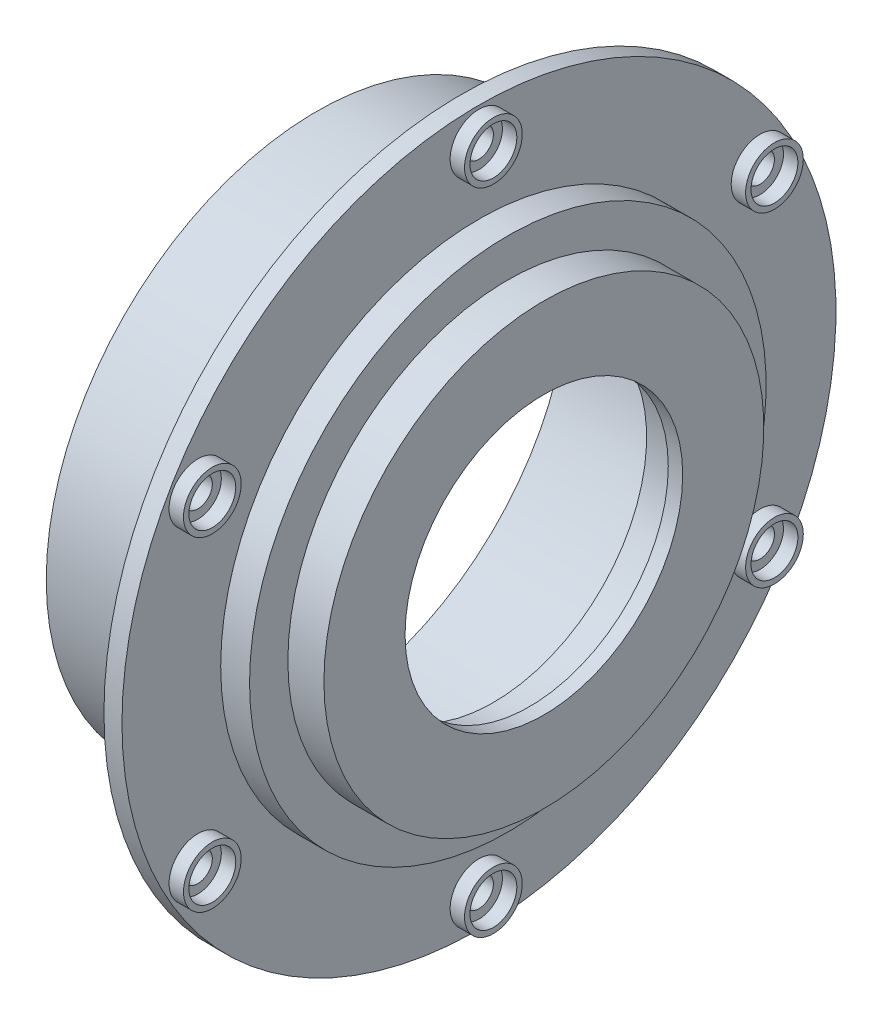
ISO-10303-21;
HEADER;
FILE_DESCRIPTION(('STEP AP214'),'2;1');
FILE_NAME('part.step','',(''),(''),'','','');
FILE_SCHEMA(('AUTOMOTIVE_DESIGN { 1 0 10303 214 1 1 1 1 }'));
ENDSEC;
DATA;
#1=APPLICATION_CONTEXT('core data for automotive mechanical design processes');
#2=APPLICATION_PROTOCOL_DEFINITION('international standard','automotive_design',2000,#1);
#3=PRODUCT_CONTEXT('',#1,'mechanical');
#4=PRODUCT('Part','Part','',(#3));
#5=PRODUCT_RELATED_PRODUCT_CATEGORY('part','',(#4));
#6=PRODUCT_DEFINITION_FORMATION('','',#4);
#7=PRODUCT_DEFINITION_CONTEXT('part definition',#1,'design');
#8=PRODUCT_DEFINITION('design','',#6,#7);
#9=PRODUCT_DEFINITION_SHAPE('','',#8);
#10=(LENGTH_UNIT() NAMED_UNIT(*) SI_UNIT(.MILLI.,.METRE.));
#11=(NAMED_UNIT(*) PLANE_ANGLE_UNIT() SI_UNIT($,.RADIAN.));
#12=(NAMED_UNIT(*) SI_UNIT($,.STERADIAN.) SOLID_ANGLE_UNIT());
#13=UNCERTAINTY_MEASURE_WITH_UNIT(LENGTH_MEASURE(1.E-05),#10,'distance_accuracy_value','');
#14=(GEOMETRIC_REPRESENTATION_CONTEXT(3) GLOBAL_UNCERTAINTY_ASSIGNED_CONTEXT((#13)) GLOBAL_UNIT_ASSIGNED_CONTEXT((#10,
#11,#12)) REPRESENTATION_CONTEXT('',''));
#15=CARTESIAN_POINT('',(0.,0.,0.));
#16=DIRECTION('',(0.,0.,1.));
#17=DIRECTION('',(1.,0.,0.));
#18=AXIS2_PLACEMENT_3D('',#15,#16,#17);
#19=CARTESIAN_POINT('',(45.,29.,0.));
#20=DIRECTION('',(-1.,0.,0.));
#21=DIRECTION('',(0.,0.,1.));
#22=AXIS2_PLACEMENT_3D('',#19,#20,#21);
#23=PLANE('',#22);
#24=CARTESIAN_POINT('',(45.,20.,0.));
#25=DIRECTION('',(1.,0.,0.));
#26=DIRECTION('',(0.,0.,-1.));
#27=AXIS2_PLACEMENT_3D('',#24,#25,#26);
#28=CIRCLE('',#27,4.);
#29=CARTESIAN_POINT('',(45.,20.,-4.));
#30=VERTEX_POINT('',#29);
#31=EDGE_CURVE('E165',#30,#30,#28,.T.);
#32=ORIENTED_EDGE('',*,*,#31,.F.);
#33=EDGE_LOOP('',(#32));
#34=FACE_BOUND('',#33,.T.);
#35=CARTESIAN_POINT('',(45.,20.,0.));
#36=DIRECTION('',(1.,0.,0.));
#37=DIRECTION('',(0.,0.,-1.));
#38=AXIS2_PLACEMENT_3D('',#35,#36,#37);
#39=CIRCLE('',#38,6.5);
#40=CARTESIAN_POINT('',(45.,20.,-6.5));
#41=VERTEX_POINT('',#40);
#42=EDGE_CURVE('E236',#41,#41,#39,.T.);
#43=ORIENTED_EDGE('',*,*,#42,.T.);
#44=EDGE_LOOP('',(#43));
#45=FACE_BOUND('',#44,.T.);
#46=ADVANCED_FACE('F45',(#34,#45),#23,.F.);
#47=CARTESIAN_POINT('',(45.,-25.000000000001,77.9422863405978));
#48=DIRECTION('',(1.,0.,0.));
#49=DIRECTION('',(0.,0.,-1.));
#50=AXIS2_PLACEMENT_3D('',#47,#48,#49);
#51=CIRCLE('',#50,4.00000000000001);
#52=CARTESIAN_POINT('',(45.,-25.000000000001,73.9422863405978));
#53=VERTEX_POINT('',#52);
#54=EDGE_CURVE('E171',#53,#53,#51,.T.);
#55=ORIENTED_EDGE('',*,*,#54,.F.);
#56=EDGE_LOOP('',(#55));
#57=FACE_BOUND('',#56,.T.);
#58=CARTESIAN_POINT('',(45.,-25.0000000000046,77.9422863405958));
#59=DIRECTION('',(1.,0.,0.));
#60=DIRECTION('',(0.,0.,-1.));
#61=AXIS2_PLACEMENT_3D('',#58,#59,#60);
#62=CIRCLE('',#61,6.5);
#63=CARTESIAN_POINT('',(45.,-25.0000000000046,71.4422863405958));
#64=VERTEX_POINT('',#63);
#65=EDGE_CURVE('E203',#64,#64,#62,.T.);
#66=ORIENTED_EDGE('',*,*,#65,.T.);
#67=EDGE_LOOP('',(#66));
#68=FACE_BOUND('',#67,.T.);
#69=ADVANCED_FACE('F282',(#57,#68),#23,.F.);
#70=CARTESIAN_POINT('',(45.,-115.000000000001,77.9422863405965));
#71=DIRECTION('',(1.,0.,0.));
#72=DIRECTION('',(0.,0.,-1.));
#73=AXIS2_PLACEMENT_3D('',#70,#71,#72);
#74=CIRCLE('',#73,4.00000000000001);
#75=CARTESIAN_POINT('',(45.,-115.000000000001,73.9422863405965));
#76=VERTEX_POINT('',#75);
#77=EDGE_CURVE('E166',#76,#76,#74,.T.);
#78=ORIENTED_EDGE('',*,*,#77,.F.);
#79=EDGE_LOOP('',(#78));
#80=FACE_BOUND('',#79,.T.);
#81=CARTESIAN_POINT('',(45.,-115.000000000005,77.9422863405903));
#82=DIRECTION('',(1.,0.,0.));
#83=DIRECTION('',(0.,0.,-1.));
#84=AXIS2_PLACEMENT_3D('',#81,#82,#83);
#85=CIRCLE('',#84,6.5);
#86=CARTESIAN_POINT('',(45.,-115.000000000005,71.4422863405903));
#87=VERTEX_POINT('',#86);
#88=EDGE_CURVE('E194',#87,#87,#85,.T.);
#89=ORIENTED_EDGE('',*,*,#88,.T.);
#90=EDGE_LOOP('',(#89));
#91=FACE_BOUND('',#90,.T.);
#92=ADVANCED_FACE('F290',(#80,#91),#23,.F.);
#93=CARTESIAN_POINT('',(45.,-160.,-3.8049674916468E-12));
#94=DIRECTION('',(1.,0.,0.));
#95=DIRECTION('',(0.,0.,-1.));
#96=AXIS2_PLACEMENT_3D('',#93,#94,#95);
#97=CIRCLE('',#96,4.);
#98=CARTESIAN_POINT('',(45.,-160.,-4.00000000000381));
#99=VERTEX_POINT('',#98);
#100=EDGE_CURVE('E170',#99,#99,#97,.T.);
#101=ORIENTED_EDGE('',*,*,#100,.F.);
#102=EDGE_LOOP('',(#101));
#103=FACE_BOUND('',#102,.T.);
#104=CARTESIAN_POINT('',(45.,-160.,-1.211831750004E-11));
#105=DIRECTION('',(1.,0.,0.));
#106=DIRECTION('',(0.,0.,-1.));
#107=AXIS2_PLACEMENT_3D('',#104,#105,#106);
#108=CIRCLE('',#107,6.5);
#109=CARTESIAN_POINT('',(45.,-160.,-6.50000000001212));
#110=VERTEX_POINT('',#109);
#111=EDGE_CURVE('E208',#110,#110,#108,.T.);
#112=ORIENTED_EDGE('',*,*,#111,.T.);
#113=EDGE_LOOP('',(#112));
#114=FACE_BOUND('',#113,.T.);
#115=ADVANCED_FACE('F320',(#103,#114),#23,.F.);
#116=CARTESIAN_POINT('',(45.,-114.999999999998,-77.9422863406026));
#117=DIRECTION('',(1.,0.,0.));
#118=DIRECTION('',(0.,0.,-1.));
#119=AXIS2_PLACEMENT_3D('',#116,#117,#118);
#120=CIRCLE('',#119,4.00000000000001);
#121=CARTESIAN_POINT('',(45.,-114.999999999998,-81.9422863406026));
#122=VERTEX_POINT('',#121);
#123=EDGE_CURVE('E175',#122,#122,#120,.T.);
#124=ORIENTED_EDGE('',*,*,#123,.F.);
#125=EDGE_LOOP('',(#124));
#126=FACE_BOUND('',#125,.T.);
#127=CARTESIAN_POINT('',(45.,-114.999999999995,-77.9422863406088));
#128=DIRECTION('',(1.,0.,0.));
#129=DIRECTION('',(0.,0.,-1.));
#130=AXIS2_PLACEMENT_3D('',#127,#128,#129);
#131=CIRCLE('',#130,6.5);
#132=CARTESIAN_POINT('',(45.,-114.999999999995,-84.4422863406088));
#133=VERTEX_POINT('',#132);
#134=EDGE_CURVE('E220',#133,#133,#131,.T.);
#135=ORIENTED_EDGE('',*,*,#134,.T.);
#136=EDGE_LOOP('',(#135));
#137=FACE_BOUND('',#136,.T.);
#138=ADVANCED_FACE('F312',(#126,#137),#23,.F.);
#139=CARTESIAN_POINT('',(45.,-24.9999999999982,-77.9422863406007));
#140=DIRECTION('',(1.,0.,0.));
#141=DIRECTION('',(0.,0.,-1.));
#142=AXIS2_PLACEMENT_3D('',#139,#140,#141);
#143=CIRCLE('',#142,4.00000000000001);
#144=CARTESIAN_POINT('',(45.,-24.9999999999982,-81.9422863406007));
#145=VERTEX_POINT('',#144);
#146=EDGE_CURVE('E179',#145,#145,#143,.T.);
#147=ORIENTED_EDGE('',*,*,#146,.F.);
#148=EDGE_LOOP('',(#147));
#149=FACE_BOUND('',#148,.T.);
#150=CARTESIAN_POINT('',(45.,-24.9999999999947,-77.9422863406027));
#151=DIRECTION('',(1.,0.,0.));
#152=DIRECTION('',(0.,0.,-1.));
#153=AXIS2_PLACEMENT_3D('',#150,#151,#152);
#154=CIRCLE('',#153,6.5);
#155=CARTESIAN_POINT('',(45.,-24.9999999999947,-84.4422863406028));
#156=VERTEX_POINT('',#155);
#157=EDGE_CURVE('E232',#156,#156,#154,.T.);
#158=ORIENTED_EDGE('',*,*,#157,.T.);
#159=EDGE_LOOP('',(#158));
#160=FACE_BOUND('',#159,.T.);
#161=ADVANCED_FACE('F300',(#149,#160),#23,.F.);
#162=CARTESIAN_POINT('',(0.,0.,0.));
#163=DIRECTION('',(1.,0.,0.));
#164=DIRECTION('',(0.,0.,-1.));
#165=AXIS2_PLACEMENT_3D('',#162,#163,#164);
#166=PLANE('',#165);
#167=CARTESIAN_POINT('',(0.,-70.,0.));
#168=DIRECTION('',(-1.,0.,0.));
#169=DIRECTION('',(0.,0.,1.));
#170=AXIS2_PLACEMENT_3D('',#167,#168,#169);
#171=CIRCLE('',#170,70.);
#172=CARTESIAN_POINT('',(0.,-70.,70.));
#173=VERTEX_POINT('',#172);
#174=EDGE_CURVE('E137',#173,#173,#171,.T.);
#175=ORIENTED_EDGE('',*,*,#174,.F.);
#176=EDGE_LOOP('',(#175));
#177=FACE_BOUND('',#176,.T.);
#178=CARTESIAN_POINT('',(0.,-70.,0.));
#179=DIRECTION('',(-1.,0.,0.));
#180=DIRECTION('',(0.,0.,1.));
#181=AXIS2_PLACEMENT_3D('',#178,#179,#180);
#182=CIRCLE('',#181,75.);
#183=CARTESIAN_POINT('',(0.,-70.,75.));
#184=VERTEX_POINT('',#183);
#185=EDGE_CURVE('E77',#184,#184,#182,.T.);
#186=ORIENTED_EDGE('',*,*,#185,.T.);
#187=EDGE_LOOP('',(#186));
#188=FACE_BOUND('',#187,.T.);
#189=ADVANCED_FACE('F47',(#177,#188),#166,.F.);
#190=CARTESIAN_POINT('',(0.,-70.,0.));
#191=DIRECTION('',(-1.,0.,0.));
#192=DIRECTION('',(0.,0.,1.));
#193=AXIS2_PLACEMENT_3D('',#190,#191,#192);
#194=CYLINDRICAL_SURFACE('',#193,75.);
#195=ORIENTED_EDGE('',*,*,#185,.F.);
#196=EDGE_LOOP('',(#195));
#197=FACE_BOUND('',#196,.T.);
#198=CARTESIAN_POINT('',(40.,-70.,0.));
#199=DIRECTION('',(-1.,0.,0.));
#200=DIRECTION('',(0.,0.,1.));
#201=AXIS2_PLACEMENT_3D('',#198,#199,#200);
#202=CIRCLE('',#201,75.);
#203=CARTESIAN_POINT('',(40.,-70.,75.));
#204=VERTEX_POINT('',#203);
#205=EDGE_CURVE('E81',#204,#204,#202,.T.);
#206=ORIENTED_EDGE('',*,*,#205,.T.);
#207=EDGE_LOOP('',(#206));
#208=FACE_BOUND('',#207,.T.);
#209=ADVANCED_FACE('F318',(#197,#208),#194,.T.);
#210=CARTESIAN_POINT('',(40.,5.,0.));
#211=DIRECTION('',(1.,0.,0.));
#212=DIRECTION('',(0.,0.,-1.));
#213=AXIS2_PLACEMENT_3D('',#210,#211,#212);
#214=PLANE('',#213);
#215=CARTESIAN_POINT('',(40.,20.,0.));
#216=DIRECTION('',(1.,0.,0.));
#217=DIRECTION('',(0.,0.,-1.));
#218=AXIS2_PLACEMENT_3D('',#215,#216,#217);
#219=CIRCLE('',#218,4.);
#220=CARTESIAN_POINT('',(40.,20.,-4.));
#221=VERTEX_POINT('',#220);
#222=EDGE_CURVE('E141',#221,#221,#219,.T.);
#223=ORIENTED_EDGE('',*,*,#222,.T.);
#224=EDGE_LOOP('',(#223));
#225=FACE_BOUND('',#224,.T.);
#226=CARTESIAN_POINT('',(40.,-25.000000000001,77.9422863405978));
#227=DIRECTION('',(1.,0.,0.));
#228=DIRECTION('',(0.,0.,-1.));
#229=AXIS2_PLACEMENT_3D('',#226,#227,#228);
#230=CIRCLE('',#229,4.00000000000001);
#231=CARTESIAN_POINT('',(40.,-25.000000000001,73.9422863405978));
#232=VERTEX_POINT('',#231);
#233=EDGE_CURVE('E145',#232,#232,#230,.T.);
#234=ORIENTED_EDGE('',*,*,#233,.T.);
#235=EDGE_LOOP('',(#234));
#236=FACE_BOUND('',#235,.T.);
#237=CARTESIAN_POINT('',(40.,-115.000000000001,77.9422863405965));
#238=DIRECTION('',(1.,0.,0.));
#239=DIRECTION('',(0.,0.,-1.));
#240=AXIS2_PLACEMENT_3D('',#237,#238,#239);
#241=CIRCLE('',#240,4.00000000000001);
#242=CARTESIAN_POINT('',(40.,-115.000000000001,73.9422863405965));
#243=VERTEX_POINT('',#242);
#244=EDGE_CURVE('E149',#243,#243,#241,.T.);
#245=ORIENTED_EDGE('',*,*,#244,.T.);
#246=EDGE_LOOP('',(#245));
#247=FACE_BOUND('',#246,.T.);
#248=CARTESIAN_POINT('',(40.,-160.,-3.8049674916468E-12));
#249=DIRECTION('',(1.,0.,0.));
#250=DIRECTION('',(0.,0.,-1.));
#251=AXIS2_PLACEMENT_3D('',#248,#249,#250);
#252=CIRCLE('',#251,4.);
#253=CARTESIAN_POINT('',(40.,-160.,-4.00000000000381));
#254=VERTEX_POINT('',#253);
#255=EDGE_CURVE('E153',#254,#254,#252,.T.);
#256=ORIENTED_EDGE('',*,*,#255,.T.);
#257=EDGE_LOOP('',(#256));
#258=FACE_BOUND('',#257,.T.);
#259=CARTESIAN_POINT('',(40.,-114.999999999998,-77.9422863406026));
#260=DIRECTION('',(1.,0.,0.));
#261=DIRECTION('',(0.,0.,-1.));
#262=AXIS2_PLACEMENT_3D('',#259,#260,#261);
#263=CIRCLE('',#262,4.00000000000001);
#264=CARTESIAN_POINT('',(40.,-114.999999999998,-81.9422863406026));
#265=VERTEX_POINT('',#264);
#266=EDGE_CURVE('E157',#265,#265,#263,.T.);
#267=ORIENTED_EDGE('',*,*,#266,.T.);
#268=EDGE_LOOP('',(#267));
#269=FACE_BOUND('',#268,.T.);
#270=CARTESIAN_POINT('',(40.,-24.9999999999982,-77.9422863406007));
#271=DIRECTION('',(1.,0.,0.));
#272=DIRECTION('',(0.,0.,-1.));
#273=AXIS2_PLACEMENT_3D('',#270,#271,#272);
#274=CIRCLE('',#273,4.00000000000001);
#275=CARTESIAN_POINT('',(40.,-24.9999999999982,-81.9422863406007));
#276=VERTEX_POINT('',#275);
#277=EDGE_CURVE('E161',#276,#276,#274,.T.);
#278=ORIENTED_EDGE('',*,*,#277,.T.);
#279=EDGE_LOOP('',(#278));
#280=FACE_BOUND('',#279,.T.);
#281=ORIENTED_EDGE('',*,*,#205,.F.);
#282=EDGE_LOOP('',(#281));
#283=FACE_BOUND('',#282,.T.);
#284=CARTESIAN_POINT('',(40.,-70.,0.));
#285=DIRECTION('',(-1.,0.,0.));
#286=DIRECTION('',(0.,0.,1.));
#287=AXIS2_PLACEMENT_3D('',#284,#285,#286);
#288=CIRCLE('',#287,99.);
#289=CARTESIAN_POINT('',(40.,-70.,99.));
#290=VERTEX_POINT('',#289);
#291=EDGE_CURVE('E85',#290,#290,#288,.T.);
#292=ORIENTED_EDGE('',*,*,#291,.T.);
#293=EDGE_LOOP('',(#292));
#294=FACE_BOUND('',#293,.T.);
#295=ADVANCED_FACE('F309',(#225,#236,#247,#258,#269,#280,#283,#294),#214,.F.);
#296=CARTESIAN_POINT('',(0.,-70.,0.));
#297=DIRECTION('',(-1.,0.,0.));
#298=DIRECTION('',(0.,0.,1.));
#299=AXIS2_PLACEMENT_3D('',#296,#297,#298);
#300=CYLINDRICAL_SURFACE('',#299,99.);
#301=ORIENTED_EDGE('',*,*,#291,.F.);
#302=EDGE_LOOP('',(#301));
#303=FACE_BOUND('',#302,.T.);
#304=CARTESIAN_POINT('',(45.,-70.,0.));
#305=DIRECTION('',(-1.,0.,0.));
#306=DIRECTION('',(0.,0.,1.));
#307=AXIS2_PLACEMENT_3D('',#304,#305,#306);
#308=CIRCLE('',#307,99.);
#309=CARTESIAN_POINT('',(45.,-70.,99.));
#310=VERTEX_POINT('',#309);
#311=EDGE_CURVE('E89',#310,#310,#308,.T.);
#312=ORIENTED_EDGE('',*,*,#311,.T.);
#313=EDGE_LOOP('',(#312));
#314=FACE_BOUND('',#313,.T.);
#315=ADVANCED_FACE('F298',(#303,#314),#300,.T.);
#316=CARTESIAN_POINT('',(45.,20.,0.));
#317=DIRECTION('',(-1.,0.,0.));
#318=DIRECTION('',(0.,0.,1.));
#319=AXIS2_PLACEMENT_3D('',#316,#317,#318);
#320=CIRCLE('',#319,8.);
#321=CARTESIAN_POINT('',(45.,20.,8.));
#322=VERTEX_POINT('',#321);
#323=EDGE_CURVE('E10',#322,#322,#320,.F.);
#324=ORIENTED_EDGE('',*,*,#323,.F.);
#325=EDGE_LOOP('',(#324));
#326=FACE_BOUND('',#325,.T.);
#327=CARTESIAN_POINT('',(45.,-25.0000000000035,77.9422863405964));
#328=DIRECTION('',(-1.,0.,0.));
#329=DIRECTION('',(0.,0.,1.));
#330=AXIS2_PLACEMENT_3D('',#327,#328,#329);
#331=CIRCLE('',#330,8.);
#332=CARTESIAN_POINT('',(45.,-25.0000000000035,85.9422863405964));
#333=VERTEX_POINT('',#332);
#334=EDGE_CURVE('E53',#333,#333,#331,.F.);
#335=ORIENTED_EDGE('',*,*,#334,.F.);
#336=EDGE_LOOP('',(#335));
#337=FACE_BOUND('',#336,.T.);
#338=CARTESIAN_POINT('',(45.,-115.000000000004,77.9422863405922));
#339=DIRECTION('',(-1.,0.,0.));
#340=DIRECTION('',(0.,0.,1.));
#341=AXIS2_PLACEMENT_3D('',#338,#339,#340);
#342=CIRCLE('',#341,8.);
#343=CARTESIAN_POINT('',(45.,-115.000000000004,85.9422863405922));
#344=VERTEX_POINT('',#343);
#345=EDGE_CURVE('E58',#344,#344,#342,.F.);
#346=ORIENTED_EDGE('',*,*,#345,.F.);
#347=EDGE_LOOP('',(#346));
#348=FACE_BOUND('',#347,.T.);
#349=CARTESIAN_POINT('',(45.,-160.,-9.56036365130361E-12));
#350=DIRECTION('',(-1.,0.,0.));
#351=DIRECTION('',(0.,0.,1.));
#352=AXIS2_PLACEMENT_3D('',#349,#350,#351);
#353=CIRCLE('',#352,8.);
#354=CARTESIAN_POINT('',(45.,-160.,7.99999999999044));
#355=VERTEX_POINT('',#354);
#356=EDGE_CURVE('E63',#355,#355,#353,.F.);
#357=ORIENTED_EDGE('',*,*,#356,.F.);
#358=EDGE_LOOP('',(#357));
#359=FACE_BOUND('',#358,.T.);
#360=CARTESIAN_POINT('',(45.,-114.999999999996,-77.9422863406069));
#361=DIRECTION('',(-1.,0.,0.));
#362=DIRECTION('',(0.,0.,1.));
#363=AXIS2_PLACEMENT_3D('',#360,#361,#362);
#364=CIRCLE('',#363,8.00000000000001);
#365=CARTESIAN_POINT('',(45.,-114.999999999996,-69.9422863406069));
#366=VERTEX_POINT('',#365);
#367=EDGE_CURVE('E69',#366,#366,#364,.F.);
#368=ORIENTED_EDGE('',*,*,#367,.F.);
#369=EDGE_LOOP('',(#368));
#370=FACE_BOUND('',#369,.T.);
#371=CARTESIAN_POINT('',(45.,-24.9999999999957,-77.9422863406021));
#372=DIRECTION('',(-1.,0.,0.));
#373=DIRECTION('',(0.,0.,1.));
#374=AXIS2_PLACEMENT_3D('',#371,#372,#373);
#375=CIRCLE('',#374,8.);
#376=CARTESIAN_POINT('',(45.,-24.9999999999957,-69.9422863406021));
#377=VERTEX_POINT('',#376);
#378=EDGE_CURVE('E73',#377,#377,#375,.F.);
#379=ORIENTED_EDGE('',*,*,#378,.F.);
#380=EDGE_LOOP('',(#379));
#381=FACE_BOUND('',#380,.T.);
#382=ORIENTED_EDGE('',*,*,#311,.F.);
#383=EDGE_LOOP('',(#382));
#384=FACE_BOUND('',#383,.T.);
#385=CARTESIAN_POINT('',(45.,-70.,0.));
#386=DIRECTION('',(-1.,0.,0.));
#387=DIRECTION('',(0.,0.,1.));
#388=AXIS2_PLACEMENT_3D('',#385,#386,#387);
#389=CIRCLE('',#388,71.6236761755568);
#390=CARTESIAN_POINT('',(45.,-70.,71.6236761755568));
#391=VERTEX_POINT('',#390);
#392=EDGE_CURVE('E93',#391,#391,#389,.T.);
#393=ORIENTED_EDGE('',*,*,#392,.T.);
#394=EDGE_LOOP('',(#393));
#395=FACE_BOUND('',#394,.T.);
#396=ADVANCED_FACE('F285',(#326,#337,#348,#359,#370,#381,#384,#395),#23,.F.);
#397=CARTESIAN_POINT('',(0.,-70.,0.));
#398=DIRECTION('',(-1.,0.,0.));
#399=DIRECTION('',(0.,0.,1.));
#400=AXIS2_PLACEMENT_3D('',#397,#398,#399);
#401=CYLINDRICAL_SURFACE('',#400,71.6236761755568);
#402=ORIENTED_EDGE('',*,*,#392,.F.);
#403=EDGE_LOOP('',(#402));
#404=FACE_BOUND('',#403,.T.);
#405=CARTESIAN_POINT('',(53.,-70.,0.));
#406=DIRECTION('',(-1.,0.,0.));
#407=DIRECTION('',(0.,0.,1.));
#408=AXIS2_PLACEMENT_3D('',#405,#406,#407);
#409=CIRCLE('',#408,71.6236761755568);
#410=CARTESIAN_POINT('',(53.,-70.,71.6236761755568));
#411=VERTEX_POINT('',#410);
#412=EDGE_CURVE('E97',#411,#411,#409,.T.);
#413=ORIENTED_EDGE('',*,*,#412,.T.);
#414=EDGE_LOOP('',(#413));
#415=FACE_BOUND('',#414,.T.);
#416=ADVANCED_FACE('F297',(#404,#415),#401,.T.);
#417=CARTESIAN_POINT('',(53.,-9.,0.));
#418=DIRECTION('',(-1.,0.,0.));
#419=DIRECTION('',(0.,0.,1.));
#420=AXIS2_PLACEMENT_3D('',#417,#418,#419);
#421=PLANE('',#420);
#422=ORIENTED_EDGE('',*,*,#412,.F.);
#423=EDGE_LOOP('',(#422));
#424=FACE_BOUND('',#423,.T.);
#425=CARTESIAN_POINT('',(53.,-70.,0.));
#426=DIRECTION('',(-1.,0.,0.));
#427=DIRECTION('',(0.,0.,1.));
#428=AXIS2_PLACEMENT_3D('',#425,#426,#427);
#429=CIRCLE('',#428,61.);
#430=CARTESIAN_POINT('',(53.,-70.,61.));
#431=VERTEX_POINT('',#430);
#432=EDGE_CURVE('E101',#431,#431,#429,.T.);
#433=ORIENTED_EDGE('',*,*,#432,.T.);
#434=EDGE_LOOP('',(#433));
#435=FACE_BOUND('',#434,.T.);
#436=ADVANCED_FACE('F306',(#424,#435),#421,.F.);
#437=CARTESIAN_POINT('',(0.,-70.,0.));
#438=DIRECTION('',(-1.,0.,0.));
#439=DIRECTION('',(0.,0.,1.));
#440=AXIS2_PLACEMENT_3D('',#437,#438,#439);
#441=CYLINDRICAL_SURFACE('',#440,61.);
#442=ORIENTED_EDGE('',*,*,#432,.F.);
#443=EDGE_LOOP('',(#442));
#444=FACE_BOUND('',#443,.T.);
#445=CARTESIAN_POINT('',(63.,-70.,0.));
#446=DIRECTION('',(-1.,0.,0.));
#447=DIRECTION('',(0.,0.,1.));
#448=AXIS2_PLACEMENT_3D('',#445,#446,#447);
#449=CIRCLE('',#448,61.);
#450=CARTESIAN_POINT('',(63.,-70.,61.));
#451=VERTEX_POINT('',#450);
#452=EDGE_CURVE('E105',#451,#451,#449,.T.);
#453=ORIENTED_EDGE('',*,*,#452,.T.);
#454=EDGE_LOOP('',(#453));
#455=FACE_BOUND('',#454,.T.);
#456=ADVANCED_FACE('F430',(#444,#455),#441,.T.);
#457=CARTESIAN_POINT('',(63.,-31.5,0.));
#458=DIRECTION('',(-1.,0.,0.));
#459=DIRECTION('',(0.,0.,1.));
#460=AXIS2_PLACEMENT_3D('',#457,#458,#459);
#461=PLANE('',#460);
#462=ORIENTED_EDGE('',*,*,#452,.F.);
#463=EDGE_LOOP('',(#462));
#464=FACE_BOUND('',#463,.T.);
#465=CARTESIAN_POINT('',(63.,-70.,0.));
#466=DIRECTION('',(-1.,0.,0.));
#467=DIRECTION('',(0.,0.,1.));
#468=AXIS2_PLACEMENT_3D('',#465,#466,#467);
#469=CIRCLE('',#468,38.5);
#470=CARTESIAN_POINT('',(63.,-70.,38.5));
#471=VERTEX_POINT('',#470);
#472=EDGE_CURVE('E109',#471,#471,#469,.T.);
#473=ORIENTED_EDGE('',*,*,#472,.T.);
#474=EDGE_LOOP('',(#473));
#475=FACE_BOUND('',#474,.T.);
#476=ADVANCED_FACE('F426',(#464,#475),#461,.F.);
#477=CARTESIAN_POINT('',(0.,-70.,0.));
#478=DIRECTION('',(-1.,0.,0.));
#479=DIRECTION('',(0.,0.,1.));
#480=AXIS2_PLACEMENT_3D('',#477,#478,#479);
#481=CYLINDRICAL_SURFACE('',#480,38.5);
#482=ORIENTED_EDGE('',*,*,#472,.F.);
#483=EDGE_LOOP('',(#482));
#484=FACE_BOUND('',#483,.T.);
#485=CARTESIAN_POINT('',(59.,-70.,0.));
#486=DIRECTION('',(-1.,0.,0.));
#487=DIRECTION('',(0.,0.,1.));
#488=AXIS2_PLACEMENT_3D('',#485,#486,#487);
#489=CIRCLE('',#488,38.5);
#490=CARTESIAN_POINT('',(59.,-70.,38.5));
#491=VERTEX_POINT('',#490);
#492=EDGE_CURVE('E113',#491,#491,#489,.T.);
#493=ORIENTED_EDGE('',*,*,#492,.T.);
#494=EDGE_LOOP('',(#493));
#495=FACE_BOUND('',#494,.T.);
#496=ADVANCED_FACE('F422',(#484,#495),#481,.F.);
#497=CARTESIAN_POINT('',(59.,-27.5,0.));
#498=DIRECTION('',(1.,0.,0.));
#499=DIRECTION('',(0.,0.,-1.));
#500=AXIS2_PLACEMENT_3D('',#497,#498,#499);
#501=PLANE('',#500);
#502=ORIENTED_EDGE('',*,*,#492,.F.);
#503=EDGE_LOOP('',(#502));
#504=FACE_BOUND('',#503,.T.);
#505=CARTESIAN_POINT('',(59.,-70.,0.));
#506=DIRECTION('',(-1.,0.,0.));
#507=DIRECTION('',(0.,0.,1.));
#508=AXIS2_PLACEMENT_3D('',#505,#506,#507);
#509=CIRCLE('',#508,42.5);
#510=CARTESIAN_POINT('',(59.,-70.,42.5));
#511=VERTEX_POINT('',#510);
#512=EDGE_CURVE('E117',#511,#511,#509,.T.);
#513=ORIENTED_EDGE('',*,*,#512,.T.);
#514=EDGE_LOOP('',(#513));
#515=FACE_BOUND('',#514,.T.);
#516=ADVANCED_FACE('F418',(#504,#515),#501,.F.);
#517=CARTESIAN_POINT('',(0.,-70.,0.));
#518=DIRECTION('',(-1.,0.,0.));
#519=DIRECTION('',(0.,0.,1.));
#520=AXIS2_PLACEMENT_3D('',#517,#518,#519);
#521=CYLINDRICAL_SURFACE('',#520,42.5);
#522=ORIENTED_EDGE('',*,*,#512,.F.);
#523=EDGE_LOOP('',(#522));
#524=FACE_BOUND('',#523,.T.);
#525=CARTESIAN_POINT('',(49.,-70.,0.));
#526=DIRECTION('',(-1.,0.,0.));
#527=DIRECTION('',(0.,0.,1.));
#528=AXIS2_PLACEMENT_3D('',#525,#526,#527);
#529=CIRCLE('',#528,42.5);
#530=CARTESIAN_POINT('',(49.,-70.,42.5));
#531=VERTEX_POINT('',#530);
#532=EDGE_CURVE('E121',#531,#531,#529,.T.);
#533=ORIENTED_EDGE('',*,*,#532,.T.);
#534=EDGE_LOOP('',(#533));
#535=FACE_BOUND('',#534,.T.);
#536=ADVANCED_FACE('F414',(#524,#535),#521,.F.);
#537=CARTESIAN_POINT('',(49.,-9.,0.));
#538=DIRECTION('',(1.,0.,0.));
#539=DIRECTION('',(0.,0.,-1.));
#540=AXIS2_PLACEMENT_3D('',#537,#538,#539);
#541=PLANE('',#540);
#542=ORIENTED_EDGE('',*,*,#532,.F.);
#543=EDGE_LOOP('',(#542));
#544=FACE_BOUND('',#543,.T.);
#545=CARTESIAN_POINT('',(49.,-70.,0.));
#546=DIRECTION('',(-1.,0.,0.));
#547=DIRECTION('',(0.,0.,1.));
#548=AXIS2_PLACEMENT_3D('',#545,#546,#547);
#549=CIRCLE('',#548,61.);
#550=CARTESIAN_POINT('',(49.,-70.,61.));
#551=VERTEX_POINT('',#550);
#552=EDGE_CURVE('E125',#551,#551,#549,.T.);
#553=ORIENTED_EDGE('',*,*,#552,.T.);
#554=EDGE_LOOP('',(#553));
#555=FACE_BOUND('',#554,.T.);
#556=ADVANCED_FACE('F410',(#544,#555),#541,.F.);
#557=CARTESIAN_POINT('',(0.,-70.,0.));
#558=DIRECTION('',(-1.,0.,0.));
#559=DIRECTION('',(0.,0.,1.));
#560=AXIS2_PLACEMENT_3D('',#557,#558,#559);
#561=CYLINDRICAL_SURFACE('',#560,61.);
#562=ORIENTED_EDGE('',*,*,#552,.F.);
#563=EDGE_LOOP('',(#562));
#564=FACE_BOUND('',#563,.T.);
#565=CARTESIAN_POINT('',(39.,-70.,0.));
#566=DIRECTION('',(-1.,0.,0.));
#567=DIRECTION('',(0.,0.,1.));
#568=AXIS2_PLACEMENT_3D('',#565,#566,#567);
#569=CIRCLE('',#568,61.);
#570=CARTESIAN_POINT('',(39.,-70.,61.));
#571=VERTEX_POINT('',#570);
#572=EDGE_CURVE('E129',#571,#571,#569,.T.);
#573=ORIENTED_EDGE('',*,*,#572,.T.);
#574=EDGE_LOOP('',(#573));
#575=FACE_BOUND('',#574,.T.);
#576=ADVANCED_FACE('F406',(#564,#575),#561,.F.);
#577=CARTESIAN_POINT('',(39.,0.,0.));
#578=DIRECTION('',(1.,0.,0.));
#579=DIRECTION('',(0.,0.,-1.));
#580=AXIS2_PLACEMENT_3D('',#577,#578,#579);
#581=PLANE('',#580);
#582=ORIENTED_EDGE('',*,*,#572,.F.);
#583=EDGE_LOOP('',(#582));
#584=FACE_BOUND('',#583,.T.);
#585=CARTESIAN_POINT('',(39.,-70.,0.));
#586=DIRECTION('',(-1.,0.,0.));
#587=DIRECTION('',(0.,0.,1.));
#588=AXIS2_PLACEMENT_3D('',#585,#586,#587);
#589=CIRCLE('',#588,70.);
#590=CARTESIAN_POINT('',(39.,-70.,70.));
#591=VERTEX_POINT('',#590);
#592=EDGE_CURVE('E133',#591,#591,#589,.T.);
#593=ORIENTED_EDGE('',*,*,#592,.T.);
#594=EDGE_LOOP('',(#593));
#595=FACE_BOUND('',#594,.T.);
#596=ADVANCED_FACE('F402',(#584,#595),#581,.F.);
#597=CARTESIAN_POINT('',(0.,-70.,0.));
#598=DIRECTION('',(-1.,0.,0.));
#599=DIRECTION('',(0.,0.,1.));
#600=AXIS2_PLACEMENT_3D('',#597,#598,#599);
#601=CYLINDRICAL_SURFACE('',#600,70.);
#602=ORIENTED_EDGE('',*,*,#592,.F.);
#603=EDGE_LOOP('',(#602));
#604=FACE_BOUND('',#603,.T.);
#605=ORIENTED_EDGE('',*,*,#174,.T.);
#606=EDGE_LOOP('',(#605));
#607=FACE_BOUND('',#606,.T.);
#608=ADVANCED_FACE('F388',(#604,#607),#601,.F.);
#609=CARTESIAN_POINT('',(35.,-24.9999999999982,-77.9422863406007));
#610=DIRECTION('',(1.,0.,0.));
#611=DIRECTION('',(0.,0.,-1.));
#612=AXIS2_PLACEMENT_3D('',#609,#610,#611);
#613=CYLINDRICAL_SURFACE('',#612,4.00000000000001);
#614=ORIENTED_EDGE('',*,*,#146,.T.);
#615=EDGE_LOOP('',(#614));
#616=FACE_BOUND('',#615,.T.);
#617=ORIENTED_EDGE('',*,*,#277,.F.);
#618=EDGE_LOOP('',(#617));
#619=FACE_BOUND('',#618,.T.);
#620=ADVANCED_FACE('F384',(#616,#619),#613,.F.);
#621=CARTESIAN_POINT('',(35.,-114.999999999998,-77.9422863406026));
#622=DIRECTION('',(1.,0.,0.));
#623=DIRECTION('',(0.,0.,-1.));
#624=AXIS2_PLACEMENT_3D('',#621,#622,#623);
#625=CYLINDRICAL_SURFACE('',#624,4.00000000000001);
#626=ORIENTED_EDGE('',*,*,#123,.T.);
#627=EDGE_LOOP('',(#626));
#628=FACE_BOUND('',#627,.T.);
#629=ORIENTED_EDGE('',*,*,#266,.F.);
#630=EDGE_LOOP('',(#629));
#631=FACE_BOUND('',#630,.T.);
#632=ADVANCED_FACE('F387',(#628,#631),#625,.F.);
#633=CARTESIAN_POINT('',(35.,-160.,-3.8049674916468E-12));
#634=DIRECTION('',(1.,0.,0.));
#635=DIRECTION('',(0.,0.,-1.));
#636=AXIS2_PLACEMENT_3D('',#633,#634,#635);
#637=CYLINDRICAL_SURFACE('',#636,4.);
#638=ORIENTED_EDGE('',*,*,#100,.T.);
#639=EDGE_LOOP('',(#638));
#640=FACE_BOUND('',#639,.T.);
#641=ORIENTED_EDGE('',*,*,#255,.F.);
#642=EDGE_LOOP('',(#641));
#643=FACE_BOUND('',#642,.T.);
#644=ADVANCED_FACE('F392',(#640,#643),#637,.F.);
#645=CARTESIAN_POINT('',(35.,-115.000000000001,77.9422863405965));
#646=DIRECTION('',(1.,0.,0.));
#647=DIRECTION('',(0.,0.,-1.));
#648=AXIS2_PLACEMENT_3D('',#645,#646,#647);
#649=CYLINDRICAL_SURFACE('',#648,4.00000000000001);
#650=ORIENTED_EDGE('',*,*,#77,.T.);
#651=EDGE_LOOP('',(#650));
#652=FACE_BOUND('',#651,.T.);
#653=ORIENTED_EDGE('',*,*,#244,.F.);
#654=EDGE_LOOP('',(#653));
#655=FACE_BOUND('',#654,.T.);
#656=ADVANCED_FACE('F382',(#652,#655),#649,.F.);
#657=CARTESIAN_POINT('',(35.,-25.000000000001,77.9422863405978));
#658=DIRECTION('',(1.,0.,0.));
#659=DIRECTION('',(0.,0.,-1.));
#660=AXIS2_PLACEMENT_3D('',#657,#658,#659);
#661=CYLINDRICAL_SURFACE('',#660,4.00000000000001);
#662=ORIENTED_EDGE('',*,*,#54,.T.);
#663=EDGE_LOOP('',(#662));
#664=FACE_BOUND('',#663,.T.);
#665=ORIENTED_EDGE('',*,*,#233,.F.);
#666=EDGE_LOOP('',(#665));
#667=FACE_BOUND('',#666,.T.);
#668=ADVANCED_FACE('F378',(#664,#667),#661,.F.);
#669=CARTESIAN_POINT('',(35.,20.,0.));
#670=DIRECTION('',(1.,0.,0.));
#671=DIRECTION('',(0.,0.,-1.));
#672=AXIS2_PLACEMENT_3D('',#669,#670,#671);
#673=CYLINDRICAL_SURFACE('',#672,4.);
#674=ORIENTED_EDGE('',*,*,#31,.T.);
#675=EDGE_LOOP('',(#674));
#676=FACE_BOUND('',#675,.T.);
#677=ORIENTED_EDGE('',*,*,#222,.F.);
#678=EDGE_LOOP('',(#677));
#679=FACE_BOUND('',#678,.T.);
#680=ADVANCED_FACE('F376',(#676,#679),#673,.F.);
#681=CARTESIAN_POINT('',(49.,-24.9999999999957,-77.9422863406021));
#682=DIRECTION('',(1.,0.,0.));
#683=DIRECTION('',(0.,0.,-1.));
#684=AXIS2_PLACEMENT_3D('',#681,#682,#683);
#685=PLANE('',#684);
#686=CARTESIAN_POINT('',(49.,-24.9999999999957,-77.9422863406021));
#687=DIRECTION('',(1.,0.,0.));
#688=DIRECTION('',(0.,0.,-1.));
#689=AXIS2_PLACEMENT_3D('',#686,#687,#688);
#690=CIRCLE('',#689,8.);
#691=CARTESIAN_POINT('',(49.,-24.9999999999957,-85.9422863406021));
#692=VERTEX_POINT('',#691);
#693=EDGE_CURVE('E224',#692,#692,#690,.T.);
#694=ORIENTED_EDGE('',*,*,#693,.T.);
#695=EDGE_LOOP('',(#694));
#696=FACE_BOUND('',#695,.T.);
#697=CARTESIAN_POINT('',(49.,-24.9999999999947,-77.9422863406027));
#698=DIRECTION('',(1.,0.,0.));
#699=DIRECTION('',(0.,0.,-1.));
#700=AXIS2_PLACEMENT_3D('',#697,#698,#699);
#701=CIRCLE('',#700,6.5);
#702=CARTESIAN_POINT('',(49.,-24.9999999999947,-84.4422863406028));
#703=VERTEX_POINT('',#702);
#704=EDGE_CURVE('E228',#703,#703,#701,.T.);
#705=ORIENTED_EDGE('',*,*,#704,.F.);
#706=EDGE_LOOP('',(#705));
#707=FACE_BOUND('',#706,.T.);
#708=ADVANCED_FACE('F339',(#696,#707),#685,.T.);
#709=CARTESIAN_POINT('',(49.,-24.9999999999957,-77.9422863406021));
#710=DIRECTION('',(-1.,0.,0.));
#711=DIRECTION('',(0.,0.,1.));
#712=AXIS2_PLACEMENT_3D('',#709,#710,#711);
#713=CYLINDRICAL_SURFACE('',#712,8.);
#714=ORIENTED_EDGE('',*,*,#693,.F.);
#715=EDGE_LOOP('',(#714));
#716=FACE_BOUND('',#715,.T.);
#717=ORIENTED_EDGE('',*,*,#378,.T.);
#718=EDGE_LOOP('',(#717));
#719=FACE_BOUND('',#718,.T.);
#720=ADVANCED_FACE('F329',(#716,#719),#713,.T.);
#721=CARTESIAN_POINT('',(49.,-24.9999999999947,-77.9422863406027));
#722=DIRECTION('',(-1.,0.,0.));
#723=DIRECTION('',(0.,0.,1.));
#724=AXIS2_PLACEMENT_3D('',#721,#722,#723);
#725=CYLINDRICAL_SURFACE('',#724,6.5);
#726=ORIENTED_EDGE('',*,*,#704,.T.);
#727=EDGE_LOOP('',(#726));
#728=FACE_BOUND('',#727,.T.);
#729=ORIENTED_EDGE('',*,*,#157,.F.);
#730=EDGE_LOOP('',(#729));
#731=FACE_BOUND('',#730,.T.);
#732=ADVANCED_FACE('F326',(#728,#731),#725,.F.);
#733=CARTESIAN_POINT('',(49.,-114.999999999996,-77.9422863406069));
#734=DIRECTION('',(1.,0.,0.));
#735=DIRECTION('',(0.,0.,-1.));
#736=AXIS2_PLACEMENT_3D('',#733,#734,#735);
#737=PLANE('',#736);
#738=CARTESIAN_POINT('',(49.,-114.999999999996,-77.9422863406069));
#739=DIRECTION('',(1.,0.,0.));
#740=DIRECTION('',(0.,0.,-1.));
#741=AXIS2_PLACEMENT_3D('',#738,#739,#740);
#742=CIRCLE('',#741,8.00000000000001);
#743=CARTESIAN_POINT('',(49.,-114.999999999996,-85.9422863406069));
#744=VERTEX_POINT('',#743);
#745=EDGE_CURVE('E212',#744,#744,#742,.T.);
#746=ORIENTED_EDGE('',*,*,#745,.T.);
#747=EDGE_LOOP('',(#746));
#748=FACE_BOUND('',#747,.T.);
#749=CARTESIAN_POINT('',(49.,-114.999999999995,-77.9422863406088));
#750=DIRECTION('',(1.,0.,0.));
#751=DIRECTION('',(0.,0.,-1.));
#752=AXIS2_PLACEMENT_3D('',#749,#750,#751);
#753=CIRCLE('',#752,6.5);
#754=CARTESIAN_POINT('',(49.,-114.999999999995,-84.4422863406088));
#755=VERTEX_POINT('',#754);
#756=EDGE_CURVE('E216',#755,#755,#753,.T.);
#757=ORIENTED_EDGE('',*,*,#756,.F.);
#758=EDGE_LOOP('',(#757));
#759=FACE_BOUND('',#758,.T.);
#760=ADVANCED_FACE('F328',(#748,#759),#737,.T.);
#761=CARTESIAN_POINT('',(49.,-114.999999999996,-77.9422863406069));
#762=DIRECTION('',(-1.,0.,0.));
#763=DIRECTION('',(0.,0.,1.));
#764=AXIS2_PLACEMENT_3D('',#761,#762,#763);
#765=CYLINDRICAL_SURFACE('',#764,8.00000000000001);
#766=ORIENTED_EDGE('',*,*,#745,.F.);
#767=EDGE_LOOP('',(#766));
#768=FACE_BOUND('',#767,.T.);
#769=ORIENTED_EDGE('',*,*,#367,.T.);
#770=EDGE_LOOP('',(#769));
#771=FACE_BOUND('',#770,.T.);
#772=ADVANCED_FACE('F336',(#768,#771),#765,.T.);
#773=CARTESIAN_POINT('',(49.,-114.999999999995,-77.9422863406088));
#774=DIRECTION('',(-1.,0.,0.));
#775=DIRECTION('',(0.,0.,1.));
#776=AXIS2_PLACEMENT_3D('',#773,#774,#775);
#777=CYLINDRICAL_SURFACE('',#776,6.5);
#778=ORIENTED_EDGE('',*,*,#756,.T.);
#779=EDGE_LOOP('',(#778));
#780=FACE_BOUND('',#779,.T.);
#781=ORIENTED_EDGE('',*,*,#134,.F.);
#782=EDGE_LOOP('',(#781));
#783=FACE_BOUND('',#782,.T.);
#784=ADVANCED_FACE('F345',(#780,#783),#777,.F.);
#785=CARTESIAN_POINT('',(49.,-160.,-9.56036365130361E-12));
#786=DIRECTION('',(1.,0.,0.));
#787=DIRECTION('',(0.,0.,-1.));
#788=AXIS2_PLACEMENT_3D('',#785,#786,#787);
#789=PLANE('',#788);
#790=CARTESIAN_POINT('',(49.,-160.,-9.56036365130361E-12));
#791=DIRECTION('',(1.,0.,0.));
#792=DIRECTION('',(0.,0.,-1.));
#793=AXIS2_PLACEMENT_3D('',#790,#791,#792);
#794=CIRCLE('',#793,8.);
#795=CARTESIAN_POINT('',(49.,-160.,-8.00000000000956));
#796=VERTEX_POINT('',#795);
#797=EDGE_CURVE('E199',#796,#796,#794,.T.);
#798=ORIENTED_EDGE('',*,*,#797,.T.);
#799=EDGE_LOOP('',(#798));
#800=FACE_BOUND('',#799,.T.);
#801=CARTESIAN_POINT('',(49.,-160.,-1.211831750004E-11));
#802=DIRECTION('',(1.,0.,0.));
#803=DIRECTION('',(0.,0.,-1.));
#804=AXIS2_PLACEMENT_3D('',#801,#802,#803);
#805=CIRCLE('',#804,6.5);
#806=CARTESIAN_POINT('',(49.,-160.,-6.50000000001212));
#807=VERTEX_POINT('',#806);
#808=EDGE_CURVE('E204',#807,#807,#805,.T.);
#809=ORIENTED_EDGE('',*,*,#808,.F.);
#810=EDGE_LOOP('',(#809));
#811=FACE_BOUND('',#810,.T.);
#812=ADVANCED_FACE('F350',(#800,#811),#789,.T.);
#813=CARTESIAN_POINT('',(49.,-160.,-9.56036365130361E-12));
#814=DIRECTION('',(-1.,0.,0.));
#815=DIRECTION('',(0.,0.,1.));
#816=AXIS2_PLACEMENT_3D('',#813,#814,#815);
#817=CYLINDRICAL_SURFACE('',#816,8.);
#818=ORIENTED_EDGE('',*,*,#797,.F.);
#819=EDGE_LOOP('',(#818));
#820=FACE_BOUND('',#819,.T.);
#821=ORIENTED_EDGE('',*,*,#356,.T.);
#822=EDGE_LOOP('',(#821));
#823=FACE_BOUND('',#822,.T.);
#824=ADVANCED_FACE('F352',(#820,#823),#817,.T.);
#825=CARTESIAN_POINT('',(49.,-160.,-1.211831750004E-11));
#826=DIRECTION('',(-1.,0.,0.));
#827=DIRECTION('',(0.,0.,1.));
#828=AXIS2_PLACEMENT_3D('',#825,#826,#827);
#829=CYLINDRICAL_SURFACE('',#828,6.5);
#830=ORIENTED_EDGE('',*,*,#808,.T.);
#831=EDGE_LOOP('',(#830));
#832=FACE_BOUND('',#831,.T.);
#833=ORIENTED_EDGE('',*,*,#111,.F.);
#834=EDGE_LOOP('',(#833));
#835=FACE_BOUND('',#834,.T.);
#836=ADVANCED_FACE('F355',(#832,#835),#829,.F.);
#837=CARTESIAN_POINT('',(49.,-115.000000000004,77.9422863405922));
#838=DIRECTION('',(1.,0.,0.));
#839=DIRECTION('',(0.,0.,-1.));
#840=AXIS2_PLACEMENT_3D('',#837,#838,#839);
#841=PLANE('',#840);
#842=CARTESIAN_POINT('',(49.,-115.000000000004,77.9422863405922));
#843=DIRECTION('',(1.,0.,0.));
#844=DIRECTION('',(0.,0.,-1.));
#845=AXIS2_PLACEMENT_3D('',#842,#843,#844);
#846=CIRCLE('',#845,8.);
#847=CARTESIAN_POINT('',(49.,-115.000000000004,69.9422863405922));
#848=VERTEX_POINT('',#847);
#849=EDGE_CURVE('E195',#848,#848,#846,.T.);
#850=ORIENTED_EDGE('',*,*,#849,.T.);
#851=EDGE_LOOP('',(#850));
#852=FACE_BOUND('',#851,.T.);
#853=CARTESIAN_POINT('',(49.,-115.000000000005,77.9422863405903));
#854=DIRECTION('',(1.,0.,0.));
#855=DIRECTION('',(0.,0.,-1.));
#856=AXIS2_PLACEMENT_3D('',#853,#854,#855);
#857=CIRCLE('',#856,6.5);
#858=CARTESIAN_POINT('',(49.,-115.000000000005,71.4422863405903));
#859=VERTEX_POINT('',#858);
#860=EDGE_CURVE('E190',#859,#859,#857,.T.);
#861=ORIENTED_EDGE('',*,*,#860,.F.);
#862=EDGE_LOOP('',(#861));
#863=FACE_BOUND('',#862,.T.);
#864=ADVANCED_FACE('F362',(#852,#863),#841,.T.);
#865=CARTESIAN_POINT('',(49.,-115.000000000004,77.9422863405922));
#866=DIRECTION('',(-1.,0.,0.));
#867=DIRECTION('',(0.,0.,1.));
#868=AXIS2_PLACEMENT_3D('',#865,#866,#867);
#869=CYLINDRICAL_SURFACE('',#868,8.);
#870=ORIENTED_EDGE('',*,*,#849,.F.);
#871=EDGE_LOOP('',(#870));
#872=FACE_BOUND('',#871,.T.);
#873=ORIENTED_EDGE('',*,*,#345,.T.);
#874=EDGE_LOOP('',(#873));
#875=FACE_BOUND('',#874,.T.);
#876=ADVANCED_FACE('F364',(#872,#875),#869,.T.);
#877=CARTESIAN_POINT('',(49.,-115.000000000005,77.9422863405903));
#878=DIRECTION('',(-1.,0.,0.));
#879=DIRECTION('',(0.,0.,1.));
#880=AXIS2_PLACEMENT_3D('',#877,#878,#879);
#881=CYLINDRICAL_SURFACE('',#880,6.5);
#882=ORIENTED_EDGE('',*,*,#860,.T.);
#883=EDGE_LOOP('',(#882));
#884=FACE_BOUND('',#883,.T.);
#885=ORIENTED_EDGE('',*,*,#88,.F.);
#886=EDGE_LOOP('',(#885));
#887=FACE_BOUND('',#886,.T.);
#888=ADVANCED_FACE('F367',(#884,#887),#881,.F.);
#889=CARTESIAN_POINT('',(49.,-25.0000000000035,77.9422863405964));
#890=DIRECTION('',(1.,0.,0.));
#891=DIRECTION('',(0.,0.,-1.));
#892=AXIS2_PLACEMENT_3D('',#889,#890,#891);
#893=PLANE('',#892);
#894=CARTESIAN_POINT('',(49.,-25.0000000000035,77.9422863405964));
#895=DIRECTION('',(1.,0.,0.));
#896=DIRECTION('',(0.,0.,-1.));
#897=AXIS2_PLACEMENT_3D('',#894,#895,#896);
#898=CIRCLE('',#897,8.);
#899=CARTESIAN_POINT('',(49.,-25.0000000000035,69.9422863405964));
#900=VERTEX_POINT('',#899);
#901=EDGE_CURVE('E244',#900,#900,#898,.T.);
#902=ORIENTED_EDGE('',*,*,#901,.T.);
#903=EDGE_LOOP('',(#902));
#904=FACE_BOUND('',#903,.T.);
#905=CARTESIAN_POINT('',(49.,-25.0000000000046,77.9422863405958));
#906=DIRECTION('',(1.,0.,0.));
#907=DIRECTION('',(0.,0.,-1.));
#908=AXIS2_PLACEMENT_3D('',#905,#906,#907);
#909=CIRCLE('',#908,6.5);
#910=CARTESIAN_POINT('',(49.,-25.0000000000046,71.4422863405958));
#911=VERTEX_POINT('',#910);
#912=EDGE_CURVE('E240',#911,#911,#909,.T.);
#913=ORIENTED_EDGE('',*,*,#912,.F.);
#914=EDGE_LOOP('',(#913));
#915=FACE_BOUND('',#914,.T.);
#916=ADVANCED_FACE('F374',(#904,#915),#893,.T.);
#917=CARTESIAN_POINT('',(49.,-25.0000000000035,77.9422863405964));
#918=DIRECTION('',(-1.,0.,0.));
#919=DIRECTION('',(0.,0.,1.));
#920=AXIS2_PLACEMENT_3D('',#917,#918,#919);
#921=CYLINDRICAL_SURFACE('',#920,8.);
#922=ORIENTED_EDGE('',*,*,#901,.F.);
#923=EDGE_LOOP('',(#922));
#924=FACE_BOUND('',#923,.T.);
#925=ORIENTED_EDGE('',*,*,#334,.T.);
#926=EDGE_LOOP('',(#925));
#927=FACE_BOUND('',#926,.T.);
#928=ADVANCED_FACE('F277',(#924,#927),#921,.T.);
#929=CARTESIAN_POINT('',(49.,-25.0000000000046,77.9422863405958));
#930=DIRECTION('',(-1.,0.,0.));
#931=DIRECTION('',(0.,0.,1.));
#932=AXIS2_PLACEMENT_3D('',#929,#930,#931);
#933=CYLINDRICAL_SURFACE('',#932,6.5);
#934=ORIENTED_EDGE('',*,*,#912,.T.);
#935=EDGE_LOOP('',(#934));
#936=FACE_BOUND('',#935,.T.);
#937=ORIENTED_EDGE('',*,*,#65,.F.);
#938=EDGE_LOOP('',(#937));
#939=FACE_BOUND('',#938,.T.);
#940=ADVANCED_FACE('F268',(#936,#939),#933,.F.);
#941=CARTESIAN_POINT('',(49.,20.,0.));
#942=DIRECTION('',(1.,0.,0.));
#943=DIRECTION('',(0.,0.,-1.));
#944=AXIS2_PLACEMENT_3D('',#941,#942,#943);
#945=PLANE('',#944);
#946=CARTESIAN_POINT('',(49.,20.,0.));
#947=DIRECTION('',(1.,0.,0.));
#948=DIRECTION('',(0.,0.,-1.));
#949=AXIS2_PLACEMENT_3D('',#946,#947,#948);
#950=CIRCLE('',#949,8.);
#951=CARTESIAN_POINT('',(49.,20.,-8.));
#952=VERTEX_POINT('',#951);
#953=EDGE_CURVE('E186',#952,#952,#950,.T.);
#954=ORIENTED_EDGE('',*,*,#953,.T.);
#955=EDGE_LOOP('',(#954));
#956=FACE_BOUND('',#955,.T.);
#957=CARTESIAN_POINT('',(49.,20.,0.));
#958=DIRECTION('',(1.,0.,0.));
#959=DIRECTION('',(0.,0.,-1.));
#960=AXIS2_PLACEMENT_3D('',#957,#958,#959);
#961=CIRCLE('',#960,6.5);
#962=CARTESIAN_POINT('',(49.,20.,-6.5));
#963=VERTEX_POINT('',#962);
#964=EDGE_CURVE('E254',#963,#963,#961,.T.);
#965=ORIENTED_EDGE('',*,*,#964,.F.);
#966=EDGE_LOOP('',(#965));
#967=FACE_BOUND('',#966,.T.);
#968=ADVANCED_FACE('F265',(#956,#967),#945,.T.);
#969=CARTESIAN_POINT('',(49.,20.,0.));
#970=DIRECTION('',(-1.,0.,0.));
#971=DIRECTION('',(0.,0.,1.));
#972=AXIS2_PLACEMENT_3D('',#969,#970,#971);
#973=CYLINDRICAL_SURFACE('',#972,8.);
#974=ORIENTED_EDGE('',*,*,#953,.F.);
#975=EDGE_LOOP('',(#974));
#976=FACE_BOUND('',#975,.T.);
#977=ORIENTED_EDGE('',*,*,#323,.T.);
#978=EDGE_LOOP('',(#977));
#979=FACE_BOUND('',#978,.T.);
#980=ADVANCED_FACE('F267',(#976,#979),#973,.T.);
#981=CARTESIAN_POINT('',(49.,20.,0.));
#982=DIRECTION('',(-1.,0.,0.));
#983=DIRECTION('',(0.,0.,1.));
#984=AXIS2_PLACEMENT_3D('',#981,#982,#983);
#985=CYLINDRICAL_SURFACE('',#984,6.5);
#986=ORIENTED_EDGE('',*,*,#964,.T.);
#987=EDGE_LOOP('',(#986));
#988=FACE_BOUND('',#987,.T.);
#989=ORIENTED_EDGE('',*,*,#42,.F.);
#990=EDGE_LOOP('',(#989));
#991=FACE_BOUND('',#990,.T.);
#992=ADVANCED_FACE('F262',(#988,#991),#985,.F.);
#993=CLOSED_SHELL('',(#46,#69,#92,#115,#138,#161,#189,#209,#295,#315,#396,#416,#436,#456,#476,
#496,#516,#536,#556,#576,#596,#608,#620,#632,#644,#656,#668,#680,#708,#720,#732,#760,#772,#784,
#812,#824,#836,#864,#876,#888,#916,#928,#940,#968,#980,#992));
#994=MANIFOLD_SOLID_BREP('B2',#993);
#995=ADVANCED_BREP_SHAPE_REPRESENTATION('',(#18,#994),#14);
#996=SHAPE_DEFINITION_REPRESENTATION(#9,#995);
ENDSEC;
END-ISO-10303-21;
